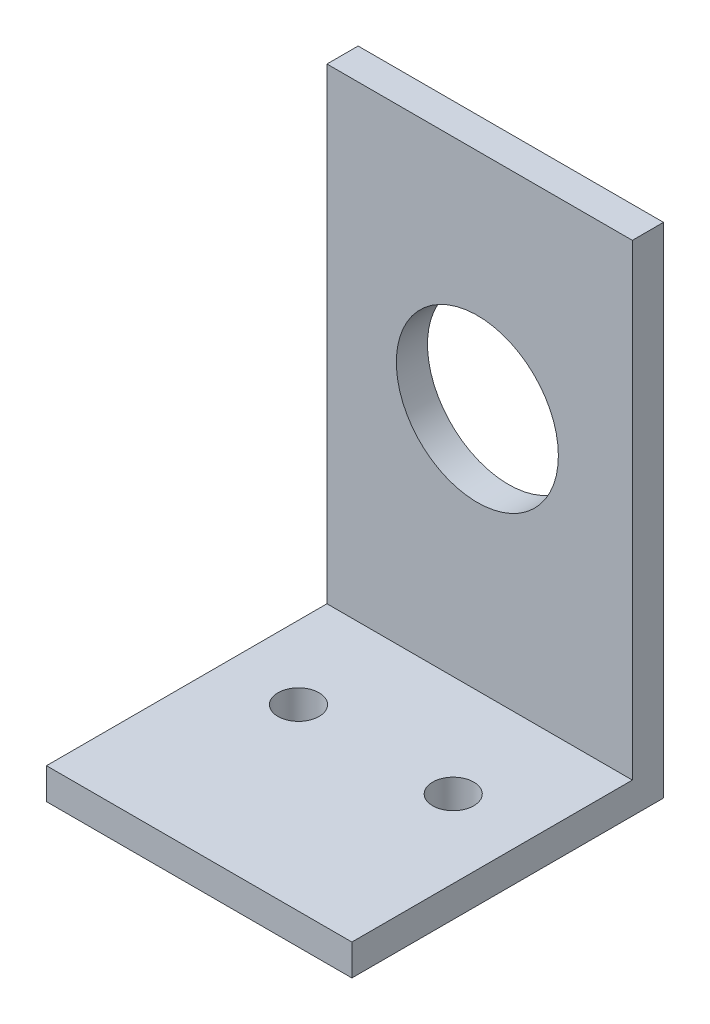
ISO-10303-21;
HEADER;
FILE_DESCRIPTION(('STEP AP214'),'2;1');
FILE_NAME('part.step','',(''),(''),'','','');
FILE_SCHEMA(('AUTOMOTIVE_DESIGN { 1 0 10303 214 1 1 1 1 }'));
ENDSEC;
DATA;
#1=APPLICATION_CONTEXT('core data for automotive mechanical design processes');
#2=APPLICATION_PROTOCOL_DEFINITION('international standard','automotive_design',2000,#1);
#3=PRODUCT_CONTEXT('',#1,'mechanical');
#4=PRODUCT('Part','Part','',(#3));
#5=PRODUCT_RELATED_PRODUCT_CATEGORY('part','',(#4));
#6=PRODUCT_DEFINITION_FORMATION('','',#4);
#7=PRODUCT_DEFINITION_CONTEXT('part definition',#1,'design');
#8=PRODUCT_DEFINITION('design','',#6,#7);
#9=PRODUCT_DEFINITION_SHAPE('','',#8);
#10=(LENGTH_UNIT() NAMED_UNIT(*) SI_UNIT(.MILLI.,.METRE.));
#11=(NAMED_UNIT(*) PLANE_ANGLE_UNIT() SI_UNIT($,.RADIAN.));
#12=(NAMED_UNIT(*) SI_UNIT($,.STERADIAN.) SOLID_ANGLE_UNIT());
#13=UNCERTAINTY_MEASURE_WITH_UNIT(LENGTH_MEASURE(1.E-05),#10,'distance_accuracy_value','');
#14=(GEOMETRIC_REPRESENTATION_CONTEXT(3) GLOBAL_UNCERTAINTY_ASSIGNED_CONTEXT((#13)) GLOBAL_UNIT_ASSIGNED_CONTEXT((#10,
#11,#12)) REPRESENTATION_CONTEXT('',''));
#15=CARTESIAN_POINT('',(0.,0.,0.));
#16=DIRECTION('',(0.,0.,1.));
#17=DIRECTION('',(1.,0.,0.));
#18=AXIS2_PLACEMENT_3D('',#15,#16,#17);
#19=CARTESIAN_POINT('',(24.5,-40.,50.));
#20=DIRECTION('',(-1.,0.,0.));
#21=DIRECTION('',(0.,0.,1.));
#22=AXIS2_PLACEMENT_3D('',#19,#20,#21);
#23=PLANE('',#22);
#24=DIRECTION('',(0.,1.,0.));
#25=VECTOR('',#24,1.);
#26=CARTESIAN_POINT('',(24.5,-35.,5.));
#27=LINE('',#26,#25);
#28=CARTESIAN_POINT('',(24.5,-35.,5.));
#29=VERTEX_POINT('',#28);
#30=CARTESIAN_POINT('',(24.5,40.,5.));
#31=VERTEX_POINT('',#30);
#32=EDGE_CURVE('E128',#29,#31,#27,.T.);
#33=ORIENTED_EDGE('',*,*,#32,.F.);
#34=DIRECTION('',(0.,0.,-1.));
#35=VECTOR('',#34,1.);
#36=CARTESIAN_POINT('',(24.5,-35.,78.0042777413819));
#37=LINE('',#36,#35);
#38=CARTESIAN_POINT('',(24.5,-35.,50.));
#39=VERTEX_POINT('',#38);
#40=EDGE_CURVE('E131',#39,#29,#37,.T.);
#41=ORIENTED_EDGE('',*,*,#40,.F.);
#42=DIRECTION('',(0.,1.,0.));
#43=VECTOR('',#42,1.);
#44=CARTESIAN_POINT('',(24.5,-40.,50.));
#45=LINE('',#44,#43);
#46=CARTESIAN_POINT('',(24.5,-40.,50.));
#47=VERTEX_POINT('',#46);
#48=EDGE_CURVE('E86',#47,#39,#45,.T.);
#49=ORIENTED_EDGE('',*,*,#48,.F.);
#50=DIRECTION('',(0.,0.,-1.));
#51=VECTOR('',#50,1.);
#52=CARTESIAN_POINT('',(24.5,-40.,50.));
#53=LINE('',#52,#51);
#54=CARTESIAN_POINT('',(24.5,-40.,0.));
#55=VERTEX_POINT('',#54);
#56=EDGE_CURVE('E79',#47,#55,#53,.T.);
#57=ORIENTED_EDGE('',*,*,#56,.T.);
#58=DIRECTION('',(0.,1.,0.));
#59=VECTOR('',#58,1.);
#60=CARTESIAN_POINT('',(24.5,-40.,0.));
#61=LINE('',#60,#59);
#62=CARTESIAN_POINT('',(24.5,40.,0.));
#63=VERTEX_POINT('',#62);
#64=EDGE_CURVE('E93',#55,#63,#61,.T.);
#65=ORIENTED_EDGE('',*,*,#64,.T.);
#66=DIRECTION('',(0.,0.,-1.));
#67=VECTOR('',#66,1.);
#68=CARTESIAN_POINT('',(24.5,40.,50.));
#69=LINE('',#68,#67);
#70=EDGE_CURVE('E112',#31,#63,#69,.T.);
#71=ORIENTED_EDGE('',*,*,#70,.F.);
#72=EDGE_LOOP('',(#33,#41,#49,#57,#65,#71));
#73=FACE_BOUND('',#72,.T.);
#74=ADVANCED_FACE('F33',(#73),#23,.F.);
#75=CARTESIAN_POINT('',(-24.5,40.,50.));
#76=DIRECTION('',(0.,-1.,0.));
#77=DIRECTION('',(0.,0.,-1.));
#78=AXIS2_PLACEMENT_3D('',#75,#76,#77);
#79=PLANE('',#78);
#80=DIRECTION('',(0.,0.,-1.));
#81=VECTOR('',#80,1.);
#82=CARTESIAN_POINT('',(-24.5,40.,50.));
#83=LINE('',#82,#81);
#84=CARTESIAN_POINT('',(-24.5,40.,5.));
#85=VERTEX_POINT('',#84);
#86=CARTESIAN_POINT('',(-24.5,40.,0.));
#87=VERTEX_POINT('',#86);
#88=EDGE_CURVE('E110',#85,#87,#83,.T.);
#89=ORIENTED_EDGE('',*,*,#88,.F.);
#90=DIRECTION('',(1.,0.,0.));
#91=VECTOR('',#90,1.);
#92=CARTESIAN_POINT('',(-24.5,40.,5.));
#93=LINE('',#92,#91);
#94=EDGE_CURVE('E100',#85,#31,#93,.T.);
#95=ORIENTED_EDGE('',*,*,#94,.T.);
#96=ORIENTED_EDGE('',*,*,#70,.T.);
#97=DIRECTION('',(-1.,0.,0.));
#98=VECTOR('',#97,1.);
#99=CARTESIAN_POINT('',(-24.5,40.,0.));
#100=LINE('',#99,#98);
#101=EDGE_CURVE('E99',#63,#87,#100,.T.);
#102=ORIENTED_EDGE('',*,*,#101,.T.);
#103=EDGE_LOOP('',(#89,#95,#96,#102));
#104=FACE_BOUND('',#103,.T.);
#105=ADVANCED_FACE('F165',(#104),#79,.F.);
#106=CARTESIAN_POINT('',(-24.5,-40.,50.));
#107=DIRECTION('',(1.,0.,0.));
#108=DIRECTION('',(0.,0.,-1.));
#109=AXIS2_PLACEMENT_3D('',#106,#107,#108);
#110=PLANE('',#109);
#111=DIRECTION('',(0.,-1.,0.));
#112=VECTOR('',#111,1.);
#113=CARTESIAN_POINT('',(-24.5,-40.,50.));
#114=LINE('',#113,#112);
#115=CARTESIAN_POINT('',(-24.5,-35.,50.));
#116=VERTEX_POINT('',#115);
#117=CARTESIAN_POINT('',(-24.5,-40.,50.));
#118=VERTEX_POINT('',#117);
#119=EDGE_CURVE('E116',#116,#118,#114,.T.);
#120=ORIENTED_EDGE('',*,*,#119,.F.);
#121=DIRECTION('',(0.,0.,-1.));
#122=VECTOR('',#121,1.);
#123=CARTESIAN_POINT('',(-24.5,-35.,50.));
#124=LINE('',#123,#122);
#125=CARTESIAN_POINT('',(-24.5,-35.,5.));
#126=VERTEX_POINT('',#125);
#127=EDGE_CURVE('E48',#116,#126,#124,.T.);
#128=ORIENTED_EDGE('',*,*,#127,.T.);
#129=DIRECTION('',(0.,1.,0.));
#130=VECTOR('',#129,1.);
#131=CARTESIAN_POINT('',(-24.5,-40.,5.));
#132=LINE('',#131,#130);
#133=EDGE_CURVE('E11',#126,#85,#132,.T.);
#134=ORIENTED_EDGE('',*,*,#133,.T.);
#135=ORIENTED_EDGE('',*,*,#88,.T.);
#136=DIRECTION('',(0.,-1.,0.));
#137=VECTOR('',#136,1.);
#138=CARTESIAN_POINT('',(-24.5,-40.,0.));
#139=LINE('',#138,#137);
#140=CARTESIAN_POINT('',(-24.5,-40.,0.));
#141=VERTEX_POINT('',#140);
#142=EDGE_CURVE('E87',#87,#141,#139,.T.);
#143=ORIENTED_EDGE('',*,*,#142,.T.);
#144=DIRECTION('',(0.,0.,-1.));
#145=VECTOR('',#144,1.);
#146=CARTESIAN_POINT('',(-24.5,-40.,50.));
#147=LINE('',#146,#145);
#148=EDGE_CURVE('E82',#118,#141,#147,.T.);
#149=ORIENTED_EDGE('',*,*,#148,.F.);
#150=EDGE_LOOP('',(#120,#128,#134,#135,#143,#149));
#151=FACE_BOUND('',#150,.T.);
#152=ADVANCED_FACE('F120',(#151),#110,.F.);
#153=CARTESIAN_POINT('',(-24.5,-40.,50.));
#154=DIRECTION('',(0.,1.,0.));
#155=DIRECTION('',(0.,0.,1.));
#156=AXIS2_PLACEMENT_3D('',#153,#154,#155);
#157=PLANE('',#156);
#158=CARTESIAN_POINT('',(12.051490402925,-40.,21.2938166085941));
#159=DIRECTION('',(0.,-1.,0.));
#160=DIRECTION('',(0.,0.,-1.));
#161=AXIS2_PLACEMENT_3D('',#158,#159,#160);
#162=CIRCLE('',#161,3.29999999999999);
#163=CARTESIAN_POINT('',(12.051490402925,-40.,17.9938166085941));
#164=VERTEX_POINT('',#163);
#165=EDGE_CURVE('E139',#164,#164,#162,.T.);
#166=ORIENTED_EDGE('',*,*,#165,.F.);
#167=EDGE_LOOP('',(#166));
#168=FACE_BOUND('',#167,.T.);
#169=CARTESIAN_POINT('',(-12.7692362254379,-40.,21.2938166085941));
#170=DIRECTION('',(0.,-1.,0.));
#171=DIRECTION('',(0.,0.,-1.));
#172=AXIS2_PLACEMENT_3D('',#169,#170,#171);
#173=CIRCLE('',#172,3.29999999999999);
#174=CARTESIAN_POINT('',(-12.7692362254379,-40.,17.9938166085941));
#175=VERTEX_POINT('',#174);
#176=EDGE_CURVE('E136',#175,#175,#173,.T.);
#177=ORIENTED_EDGE('',*,*,#176,.F.);
#178=EDGE_LOOP('',(#177));
#179=FACE_BOUND('',#178,.T.);
#180=DIRECTION('',(1.,0.,0.));
#181=VECTOR('',#180,1.);
#182=CARTESIAN_POINT('',(-24.5,-40.,0.));
#183=LINE('',#182,#181);
#184=EDGE_CURVE('E76',#141,#55,#183,.T.);
#185=ORIENTED_EDGE('',*,*,#184,.T.);
#186=ORIENTED_EDGE('',*,*,#56,.F.);
#187=DIRECTION('',(1.,0.,0.));
#188=VECTOR('',#187,1.);
#189=CARTESIAN_POINT('',(-24.5,-40.,50.));
#190=LINE('',#189,#188);
#191=EDGE_CURVE('E57',#118,#47,#190,.T.);
#192=ORIENTED_EDGE('',*,*,#191,.F.);
#193=ORIENTED_EDGE('',*,*,#148,.T.);
#194=EDGE_LOOP('',(#185,#186,#192,#193));
#195=FACE_BOUND('',#194,.T.);
#196=ADVANCED_FACE('F78',(#168,#179,#195),#157,.F.);
#197=CARTESIAN_POINT('',(0.,0.,50.));
#198=DIRECTION('',(0.,0.,-1.));
#199=DIRECTION('',(-1.,0.,0.));
#200=AXIS2_PLACEMENT_3D('',#197,#198,#199);
#201=PLANE('',#200);
#202=ORIENTED_EDGE('',*,*,#48,.T.);
#203=DIRECTION('',(-1.,0.,0.));
#204=VECTOR('',#203,1.);
#205=CARTESIAN_POINT('',(0.,-35.,50.));
#206=LINE('',#205,#204);
#207=EDGE_CURVE('E41',#39,#116,#206,.T.);
#208=ORIENTED_EDGE('',*,*,#207,.T.);
#209=ORIENTED_EDGE('',*,*,#119,.T.);
#210=ORIENTED_EDGE('',*,*,#191,.T.);
#211=EDGE_LOOP('',(#202,#208,#209,#210));
#212=FACE_BOUND('',#211,.T.);
#213=ADVANCED_FACE('F115',(#212),#201,.F.);
#214=CARTESIAN_POINT('',(0.,0.,0.));
#215=DIRECTION('',(0.,0.,-1.));
#216=DIRECTION('',(-1.,0.,0.));
#217=AXIS2_PLACEMENT_3D('',#214,#215,#216);
#218=PLANE('',#217);
#219=CARTESIAN_POINT('',(-0.370000000000037,4.13324414778621,0.));
#220=DIRECTION('',(0.,0.,1.));
#221=DIRECTION('',(1.,0.,0.));
#222=AXIS2_PLACEMENT_3D('',#219,#220,#221);
#223=CIRCLE('',#222,13.);
#224=CARTESIAN_POINT('',(12.63,4.13324414778621,0.));
#225=VERTEX_POINT('',#224);
#226=EDGE_CURVE('E142',#225,#225,#223,.T.);
#227=ORIENTED_EDGE('',*,*,#226,.T.);
#228=EDGE_LOOP('',(#227));
#229=FACE_BOUND('',#228,.T.);
#230=ORIENTED_EDGE('',*,*,#64,.F.);
#231=ORIENTED_EDGE('',*,*,#184,.F.);
#232=ORIENTED_EDGE('',*,*,#142,.F.);
#233=ORIENTED_EDGE('',*,*,#101,.F.);
#234=EDGE_LOOP('',(#230,#231,#232,#233));
#235=FACE_BOUND('',#234,.T.);
#236=ADVANCED_FACE('F97',(#229,#235),#218,.T.);
#237=CARTESIAN_POINT('',(-76.5,-35.,5.));
#238=DIRECTION('',(0.,0.,-1.));
#239=DIRECTION('',(-1.,0.,0.));
#240=AXIS2_PLACEMENT_3D('',#237,#238,#239);
#241=PLANE('',#240);
#242=CARTESIAN_POINT('',(-0.370000000000037,4.13324414778621,5.));
#243=DIRECTION('',(0.,0.,1.));
#244=DIRECTION('',(1.,0.,0.));
#245=AXIS2_PLACEMENT_3D('',#242,#243,#244);
#246=CIRCLE('',#245,13.);
#247=CARTESIAN_POINT('',(12.63,4.13324414778621,5.));
#248=VERTEX_POINT('',#247);
#249=EDGE_CURVE('E145',#248,#248,#246,.T.);
#250=ORIENTED_EDGE('',*,*,#249,.F.);
#251=EDGE_LOOP('',(#250));
#252=FACE_BOUND('',#251,.T.);
#253=ORIENTED_EDGE('',*,*,#133,.F.);
#254=DIRECTION('',(1.,0.,0.));
#255=VECTOR('',#254,1.);
#256=CARTESIAN_POINT('',(-76.5,-35.,5.));
#257=LINE('',#256,#255);
#258=EDGE_CURVE('E125',#126,#29,#257,.T.);
#259=ORIENTED_EDGE('',*,*,#258,.T.);
#260=ORIENTED_EDGE('',*,*,#32,.T.);
#261=ORIENTED_EDGE('',*,*,#94,.F.);
#262=EDGE_LOOP('',(#253,#259,#260,#261));
#263=FACE_BOUND('',#262,.T.);
#264=ADVANCED_FACE('F151',(#252,#263),#241,.F.);
#265=CARTESIAN_POINT('',(-76.5,-35.,78.0042777413819));
#266=DIRECTION('',(0.,-1.,0.));
#267=DIRECTION('',(0.,0.,-1.));
#268=AXIS2_PLACEMENT_3D('',#265,#266,#267);
#269=PLANE('',#268);
#270=CARTESIAN_POINT('',(12.051490402925,-35.,21.2938166085941));
#271=DIRECTION('',(0.,-1.,0.));
#272=DIRECTION('',(0.,0.,-1.));
#273=AXIS2_PLACEMENT_3D('',#270,#271,#272);
#274=CIRCLE('',#273,3.29999999999999);
#275=CARTESIAN_POINT('',(12.051490402925,-35.,17.9938166085941));
#276=VERTEX_POINT('',#275);
#277=EDGE_CURVE('E36',#276,#276,#274,.T.);
#278=ORIENTED_EDGE('',*,*,#277,.T.);
#279=EDGE_LOOP('',(#278));
#280=FACE_BOUND('',#279,.T.);
#281=CARTESIAN_POINT('',(-12.7692362254379,-35.,21.2938166085941));
#282=DIRECTION('',(0.,-1.,0.));
#283=DIRECTION('',(0.,0.,-1.));
#284=AXIS2_PLACEMENT_3D('',#281,#282,#283);
#285=CIRCLE('',#284,3.29999999999999);
#286=CARTESIAN_POINT('',(-12.7692362254379,-35.,17.9938166085941));
#287=VERTEX_POINT('',#286);
#288=EDGE_CURVE('E133',#287,#287,#285,.T.);
#289=ORIENTED_EDGE('',*,*,#288,.T.);
#290=EDGE_LOOP('',(#289));
#291=FACE_BOUND('',#290,.T.);
#292=ORIENTED_EDGE('',*,*,#207,.F.);
#293=ORIENTED_EDGE('',*,*,#40,.T.);
#294=ORIENTED_EDGE('',*,*,#258,.F.);
#295=ORIENTED_EDGE('',*,*,#127,.F.);
#296=EDGE_LOOP('',(#292,#293,#294,#295));
#297=FACE_BOUND('',#296,.T.);
#298=ADVANCED_FACE('F154',(#280,#291,#297),#269,.F.);
#299=CARTESIAN_POINT('',(-12.7692362254379,-40.,21.2938166085941));
#300=DIRECTION('',(0.,-1.,0.));
#301=DIRECTION('',(0.,0.,-1.));
#302=AXIS2_PLACEMENT_3D('',#299,#300,#301);
#303=CYLINDRICAL_SURFACE('',#302,3.29999999999999);
#304=ORIENTED_EDGE('',*,*,#176,.T.);
#305=EDGE_LOOP('',(#304));
#306=FACE_BOUND('',#305,.T.);
#307=ORIENTED_EDGE('',*,*,#288,.F.);
#308=EDGE_LOOP('',(#307));
#309=FACE_BOUND('',#308,.T.);
#310=ADVANCED_FACE('F183',(#306,#309),#303,.F.);
#311=CARTESIAN_POINT('',(12.051490402925,-40.,21.2938166085941));
#312=DIRECTION('',(0.,-1.,0.));
#313=DIRECTION('',(0.,0.,-1.));
#314=AXIS2_PLACEMENT_3D('',#311,#312,#313);
#315=CYLINDRICAL_SURFACE('',#314,3.29999999999999);
#316=ORIENTED_EDGE('',*,*,#165,.T.);
#317=EDGE_LOOP('',(#316));
#318=FACE_BOUND('',#317,.T.);
#319=ORIENTED_EDGE('',*,*,#277,.F.);
#320=EDGE_LOOP('',(#319));
#321=FACE_BOUND('',#320,.T.);
#322=ADVANCED_FACE('F188',(#318,#321),#315,.F.);
#323=CARTESIAN_POINT('',(-0.370000000000037,4.13324414778621,5.));
#324=DIRECTION('',(0.,0.,1.));
#325=DIRECTION('',(1.,0.,0.));
#326=AXIS2_PLACEMENT_3D('',#323,#324,#325);
#327=CYLINDRICAL_SURFACE('',#326,13.);
#328=ORIENTED_EDGE('',*,*,#226,.F.);
#329=EDGE_LOOP('',(#328));
#330=FACE_BOUND('',#329,.T.);
#331=ORIENTED_EDGE('',*,*,#249,.T.);
#332=EDGE_LOOP('',(#331));
#333=FACE_BOUND('',#332,.T.);
#334=ADVANCED_FACE('F149',(#330,#333),#327,.F.);
#335=CLOSED_SHELL('',(#74,#105,#152,#196,#213,#236,#264,#298,#310,#322,#334));
#336=MANIFOLD_SOLID_BREP('B2',#335);
#337=ADVANCED_BREP_SHAPE_REPRESENTATION('',(#18,#336),#14);
#338=SHAPE_DEFINITION_REPRESENTATION(#9,#337);
ENDSEC;
END-ISO-10303-21;
